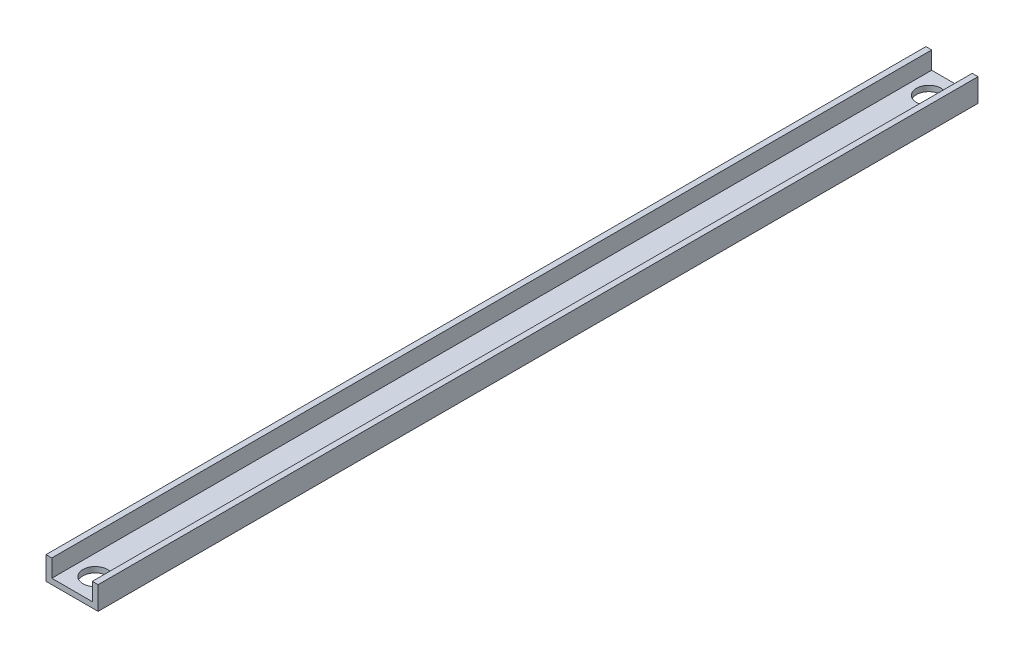
ISO-10303-21;
HEADER;
FILE_DESCRIPTION(('STEP AP214'),'2;1');
FILE_NAME('part.step','',(''),(''),'','','');
FILE_SCHEMA(('AUTOMOTIVE_DESIGN { 1 0 10303 214 1 1 1 1 }'));
ENDSEC;
DATA;
#1=APPLICATION_CONTEXT('core data for automotive mechanical design processes');
#2=APPLICATION_PROTOCOL_DEFINITION('international standard','automotive_design',2000,#1);
#3=PRODUCT_CONTEXT('',#1,'mechanical');
#4=PRODUCT('Part','Part','',(#3));
#5=PRODUCT_RELATED_PRODUCT_CATEGORY('part','',(#4));
#6=PRODUCT_DEFINITION_FORMATION('','',#4);
#7=PRODUCT_DEFINITION_CONTEXT('part definition',#1,'design');
#8=PRODUCT_DEFINITION('design','',#6,#7);
#9=PRODUCT_DEFINITION_SHAPE('','',#8);
#10=(LENGTH_UNIT() NAMED_UNIT(*) SI_UNIT(.MILLI.,.METRE.));
#11=(NAMED_UNIT(*) PLANE_ANGLE_UNIT() SI_UNIT($,.RADIAN.));
#12=(NAMED_UNIT(*) SI_UNIT($,.STERADIAN.) SOLID_ANGLE_UNIT());
#13=UNCERTAINTY_MEASURE_WITH_UNIT(LENGTH_MEASURE(1.E-05),#10,'distance_accuracy_value','');
#14=(GEOMETRIC_REPRESENTATION_CONTEXT(3) GLOBAL_UNCERTAINTY_ASSIGNED_CONTEXT((#13)) GLOBAL_UNIT_ASSIGNED_CONTEXT((#10,
#11,#12)) REPRESENTATION_CONTEXT('',''));
#15=CARTESIAN_POINT('',(0.,0.,0.));
#16=DIRECTION('',(0.,0.,1.));
#17=DIRECTION('',(1.,0.,0.));
#18=AXIS2_PLACEMENT_3D('',#15,#16,#17);
#19=CARTESIAN_POINT('',(-5.55625,-1.651,120.65));
#20=DIRECTION('',(0.,-1.,0.));
#21=DIRECTION('',(1.,0.,0.));
#22=AXIS2_PLACEMENT_3D('',#19,#20,#21);
#23=PLANE('',#22);
#24=DIRECTION('',(-1.,0.,0.));
#25=VECTOR('',#24,1.);
#26=CARTESIAN_POINT('',(-5.55625,-1.651,-120.65));
#27=LINE('',#26,#25);
#28=CARTESIAN_POINT('',(5.55625,-1.651,-120.65));
#29=VERTEX_POINT('',#28);
#30=CARTESIAN_POINT('',(-5.55625,-1.651,-120.65));
#31=VERTEX_POINT('',#30);
#32=EDGE_CURVE('E81',#29,#31,#27,.T.);
#33=ORIENTED_EDGE('',*,*,#32,.T.);
#34=DIRECTION('',(0.,0.,-1.));
#35=VECTOR('',#34,1.);
#36=CARTESIAN_POINT('',(-5.55625,-1.651,120.65));
#37=LINE('',#36,#35);
#38=CARTESIAN_POINT('',(-5.55625,-1.651,120.65));
#39=VERTEX_POINT('',#38);
#40=EDGE_CURVE('E124',#39,#31,#37,.T.);
#41=ORIENTED_EDGE('',*,*,#40,.F.);
#42=DIRECTION('',(-1.,0.,0.));
#43=VECTOR('',#42,1.);
#44=CARTESIAN_POINT('',(-5.55625,-1.651,120.65));
#45=LINE('',#44,#43);
#46=CARTESIAN_POINT('',(5.55625,-1.651,120.65));
#47=VERTEX_POINT('',#46);
#48=EDGE_CURVE('E112',#47,#39,#45,.T.);
#49=ORIENTED_EDGE('',*,*,#48,.F.);
#50=DIRECTION('',(0.,0.,-1.));
#51=VECTOR('',#50,1.);
#52=CARTESIAN_POINT('',(5.55625,-1.651,120.65));
#53=LINE('',#52,#51);
#54=EDGE_CURVE('E119',#47,#29,#53,.T.);
#55=ORIENTED_EDGE('',*,*,#54,.T.);
#56=EDGE_LOOP('',(#33,#41,#49,#55));
#57=FACE_BOUND('',#56,.T.);
#58=CARTESIAN_POINT('',(0.,-1.651,114.3));
#59=DIRECTION('',(0.,1.,0.));
#60=DIRECTION('',(0.,0.,1.));
#61=AXIS2_PLACEMENT_3D('',#58,#59,#60);
#62=CIRCLE('',#61,3.3782);
#63=CARTESIAN_POINT('',(0.,-1.651,117.6782));
#64=VERTEX_POINT('',#63);
#65=EDGE_CURVE('E182',#64,#64,#62,.T.);
#66=ORIENTED_EDGE('',*,*,#65,.F.);
#67=EDGE_LOOP('',(#66));
#68=FACE_BOUND('',#67,.T.);
#69=CARTESIAN_POINT('',(0.,-1.651,-114.3));
#70=DIRECTION('',(0.,1.,0.));
#71=DIRECTION('',(0.,0.,1.));
#72=AXIS2_PLACEMENT_3D('',#69,#70,#71);
#73=CIRCLE('',#72,3.3782);
#74=CARTESIAN_POINT('',(0.,-1.651,-110.9218));
#75=VERTEX_POINT('',#74);
#76=EDGE_CURVE('E188',#75,#75,#73,.T.);
#77=ORIENTED_EDGE('',*,*,#76,.F.);
#78=EDGE_LOOP('',(#77));
#79=FACE_BOUND('',#78,.T.);
#80=ADVANCED_FACE('F35',(#57,#68,#79),#23,.F.);
#81=CARTESIAN_POINT('',(-7.14375,3.175,120.65));
#82=DIRECTION('',(0.,-1.,0.));
#83=DIRECTION('',(1.,0.,0.));
#84=AXIS2_PLACEMENT_3D('',#81,#82,#83);
#85=PLANE('',#84);
#86=DIRECTION('',(-1.,0.,0.));
#87=VECTOR('',#86,1.);
#88=CARTESIAN_POINT('',(-7.14375,3.175,-120.65));
#89=LINE('',#88,#87);
#90=CARTESIAN_POINT('',(-5.55625,3.175,-120.65));
#91=VERTEX_POINT('',#90);
#92=CARTESIAN_POINT('',(-7.14375,3.175,-120.65));
#93=VERTEX_POINT('',#92);
#94=EDGE_CURVE('E132',#91,#93,#89,.T.);
#95=ORIENTED_EDGE('',*,*,#94,.T.);
#96=DIRECTION('',(0.,0.,-1.));
#97=VECTOR('',#96,1.);
#98=CARTESIAN_POINT('',(-7.14375,3.175,120.65));
#99=LINE('',#98,#97);
#100=CARTESIAN_POINT('',(-7.14375,3.175,120.65));
#101=VERTEX_POINT('',#100);
#102=EDGE_CURVE('E11',#101,#93,#99,.T.);
#103=ORIENTED_EDGE('',*,*,#102,.F.);
#104=DIRECTION('',(-1.,0.,0.));
#105=VECTOR('',#104,1.);
#106=CARTESIAN_POINT('',(-7.14375,3.175,120.65));
#107=LINE('',#106,#105);
#108=CARTESIAN_POINT('',(-5.55625,3.175,120.65));
#109=VERTEX_POINT('',#108);
#110=EDGE_CURVE('E147',#109,#101,#107,.T.);
#111=ORIENTED_EDGE('',*,*,#110,.F.);
#112=DIRECTION('',(0.,0.,-1.));
#113=VECTOR('',#112,1.);
#114=CARTESIAN_POINT('',(-5.55625,3.175,120.65));
#115=LINE('',#114,#113);
#116=EDGE_CURVE('E128',#109,#91,#115,.T.);
#117=ORIENTED_EDGE('',*,*,#116,.T.);
#118=EDGE_LOOP('',(#95,#103,#111,#117));
#119=FACE_BOUND('',#118,.T.);
#120=ADVANCED_FACE('F37',(#119),#85,.F.);
#121=CARTESIAN_POINT('',(-7.14375,3.175,120.65));
#122=DIRECTION('',(1.,0.,0.));
#123=DIRECTION('',(0.,1.,0.));
#124=AXIS2_PLACEMENT_3D('',#121,#122,#123);
#125=PLANE('',#124);
#126=DIRECTION('',(0.,-1.,0.));
#127=VECTOR('',#126,1.);
#128=CARTESIAN_POINT('',(-7.14375,3.175,-120.65));
#129=LINE('',#128,#127);
#130=CARTESIAN_POINT('',(-7.14375,-3.175,-120.65));
#131=VERTEX_POINT('',#130);
#132=EDGE_CURVE('E135',#93,#131,#129,.T.);
#133=ORIENTED_EDGE('',*,*,#132,.T.);
#134=DIRECTION('',(0.,0.,-1.));
#135=VECTOR('',#134,1.);
#136=CARTESIAN_POINT('',(-7.14375,-3.175,120.65));
#137=LINE('',#136,#135);
#138=CARTESIAN_POINT('',(-7.14375,-3.175,120.65));
#139=VERTEX_POINT('',#138);
#140=EDGE_CURVE('E44',#139,#131,#137,.T.);
#141=ORIENTED_EDGE('',*,*,#140,.F.);
#142=DIRECTION('',(0.,-1.,0.));
#143=VECTOR('',#142,1.);
#144=CARTESIAN_POINT('',(-7.14375,3.175,120.65));
#145=LINE('',#144,#143);
#146=EDGE_CURVE('E95',#101,#139,#145,.T.);
#147=ORIENTED_EDGE('',*,*,#146,.F.);
#148=ORIENTED_EDGE('',*,*,#102,.T.);
#149=EDGE_LOOP('',(#133,#141,#147,#148));
#150=FACE_BOUND('',#149,.T.);
#151=ADVANCED_FACE('F199',(#150),#125,.F.);
#152=CARTESIAN_POINT('',(-7.14375,-3.175,120.65));
#153=DIRECTION('',(0.,1.,0.));
#154=DIRECTION('',(-1.,0.,0.));
#155=AXIS2_PLACEMENT_3D('',#152,#153,#154);
#156=PLANE('',#155);
#157=CARTESIAN_POINT('',(0.,-3.175,-114.3));
#158=DIRECTION('',(0.,1.,0.));
#159=DIRECTION('',(-1.,0.,0.));
#160=AXIS2_PLACEMENT_3D('',#157,#158,#159);
#161=CIRCLE('',#160,3.3782);
#162=CARTESIAN_POINT('',(-3.3782,-3.175,-114.3));
#163=VERTEX_POINT('',#162);
#164=EDGE_CURVE('E185',#163,#163,#161,.T.);
#165=ORIENTED_EDGE('',*,*,#164,.T.);
#166=EDGE_LOOP('',(#165));
#167=FACE_BOUND('',#166,.T.);
#168=CARTESIAN_POINT('',(0.,-3.175,114.3));
#169=DIRECTION('',(0.,1.,0.));
#170=DIRECTION('',(-1.,0.,0.));
#171=AXIS2_PLACEMENT_3D('',#168,#169,#170);
#172=CIRCLE('',#171,3.3782);
#173=CARTESIAN_POINT('',(-3.3782,-3.175,114.3));
#174=VERTEX_POINT('',#173);
#175=EDGE_CURVE('E136',#174,#174,#172,.T.);
#176=ORIENTED_EDGE('',*,*,#175,.T.);
#177=EDGE_LOOP('',(#176));
#178=FACE_BOUND('',#177,.T.);
#179=DIRECTION('',(1.,0.,0.));
#180=VECTOR('',#179,1.);
#181=CARTESIAN_POINT('',(-7.14375,-3.175,-120.65));
#182=LINE('',#181,#180);
#183=CARTESIAN_POINT('',(7.14375,-3.175,-120.65));
#184=VERTEX_POINT('',#183);
#185=EDGE_CURVE('E138',#131,#184,#182,.T.);
#186=ORIENTED_EDGE('',*,*,#185,.T.);
#187=DIRECTION('',(0.,0.,-1.));
#188=VECTOR('',#187,1.);
#189=CARTESIAN_POINT('',(7.14375,-3.175,120.65));
#190=LINE('',#189,#188);
#191=CARTESIAN_POINT('',(7.14375,-3.175,120.65));
#192=VERTEX_POINT('',#191);
#193=EDGE_CURVE('E154',#192,#184,#190,.T.);
#194=ORIENTED_EDGE('',*,*,#193,.F.);
#195=DIRECTION('',(1.,0.,0.));
#196=VECTOR('',#195,1.);
#197=CARTESIAN_POINT('',(-7.14375,-3.175,120.65));
#198=LINE('',#197,#196);
#199=EDGE_CURVE('E162',#139,#192,#198,.T.);
#200=ORIENTED_EDGE('',*,*,#199,.F.);
#201=ORIENTED_EDGE('',*,*,#140,.T.);
#202=EDGE_LOOP('',(#186,#194,#200,#201));
#203=FACE_BOUND('',#202,.T.);
#204=ADVANCED_FACE('F160',(#167,#178,#203),#156,.F.);
#205=CARTESIAN_POINT('',(7.14375,-3.175,120.65));
#206=DIRECTION('',(-1.,0.,0.));
#207=DIRECTION('',(0.,-1.,0.));
#208=AXIS2_PLACEMENT_3D('',#205,#206,#207);
#209=PLANE('',#208);
#210=DIRECTION('',(0.,1.,0.));
#211=VECTOR('',#210,1.);
#212=CARTESIAN_POINT('',(7.14375,-3.175,-120.65));
#213=LINE('',#212,#211);
#214=CARTESIAN_POINT('',(7.14375,3.175,-120.65));
#215=VERTEX_POINT('',#214);
#216=EDGE_CURVE('E140',#184,#215,#213,.T.);
#217=ORIENTED_EDGE('',*,*,#216,.T.);
#218=DIRECTION('',(0.,0.,-1.));
#219=VECTOR('',#218,1.);
#220=CARTESIAN_POINT('',(7.14375,3.175,120.65));
#221=LINE('',#220,#219);
#222=CARTESIAN_POINT('',(7.14375,3.175,120.65));
#223=VERTEX_POINT('',#222);
#224=EDGE_CURVE('E151',#223,#215,#221,.T.);
#225=ORIENTED_EDGE('',*,*,#224,.F.);
#226=DIRECTION('',(0.,1.,0.));
#227=VECTOR('',#226,1.);
#228=CARTESIAN_POINT('',(7.14375,-3.175,120.65));
#229=LINE('',#228,#227);
#230=EDGE_CURVE('E174',#192,#223,#229,.T.);
#231=ORIENTED_EDGE('',*,*,#230,.F.);
#232=ORIENTED_EDGE('',*,*,#193,.T.);
#233=EDGE_LOOP('',(#217,#225,#231,#232));
#234=FACE_BOUND('',#233,.T.);
#235=ADVANCED_FACE('F170',(#234),#209,.F.);
#236=CARTESIAN_POINT('',(5.55625,3.175,120.65));
#237=DIRECTION('',(0.,-1.,0.));
#238=DIRECTION('',(1.,0.,0.));
#239=AXIS2_PLACEMENT_3D('',#236,#237,#238);
#240=PLANE('',#239);
#241=DIRECTION('',(-1.,0.,0.));
#242=VECTOR('',#241,1.);
#243=CARTESIAN_POINT('',(5.55625,3.175,-120.65));
#244=LINE('',#243,#242);
#245=CARTESIAN_POINT('',(5.55625,3.175,-120.65));
#246=VERTEX_POINT('',#245);
#247=EDGE_CURVE('E142',#215,#246,#244,.T.);
#248=ORIENTED_EDGE('',*,*,#247,.T.);
#249=DIRECTION('',(0.,0.,-1.));
#250=VECTOR('',#249,1.);
#251=CARTESIAN_POINT('',(5.55625,3.175,120.65));
#252=LINE('',#251,#250);
#253=CARTESIAN_POINT('',(5.55625,3.175,120.65));
#254=VERTEX_POINT('',#253);
#255=EDGE_CURVE('E123',#254,#246,#252,.T.);
#256=ORIENTED_EDGE('',*,*,#255,.F.);
#257=DIRECTION('',(-1.,0.,0.));
#258=VECTOR('',#257,1.);
#259=CARTESIAN_POINT('',(5.55625,3.175,120.65));
#260=LINE('',#259,#258);
#261=EDGE_CURVE('E114',#223,#254,#260,.T.);
#262=ORIENTED_EDGE('',*,*,#261,.F.);
#263=ORIENTED_EDGE('',*,*,#224,.T.);
#264=EDGE_LOOP('',(#248,#256,#262,#263));
#265=FACE_BOUND('',#264,.T.);
#266=ADVANCED_FACE('F173',(#265),#240,.F.);
#267=CARTESIAN_POINT('',(5.55625,-1.651,120.65));
#268=DIRECTION('',(1.,0.,0.));
#269=DIRECTION('',(0.,1.,0.));
#270=AXIS2_PLACEMENT_3D('',#267,#268,#269);
#271=PLANE('',#270);
#272=DIRECTION('',(0.,-1.,0.));
#273=VECTOR('',#272,1.);
#274=CARTESIAN_POINT('',(5.55625,-1.651,-120.65));
#275=LINE('',#274,#273);
#276=EDGE_CURVE('E122',#246,#29,#275,.T.);
#277=ORIENTED_EDGE('',*,*,#276,.T.);
#278=ORIENTED_EDGE('',*,*,#54,.F.);
#279=DIRECTION('',(0.,-1.,0.));
#280=VECTOR('',#279,1.);
#281=CARTESIAN_POINT('',(5.55625,-1.651,120.65));
#282=LINE('',#281,#280);
#283=EDGE_CURVE('E108',#254,#47,#282,.T.);
#284=ORIENTED_EDGE('',*,*,#283,.F.);
#285=ORIENTED_EDGE('',*,*,#255,.T.);
#286=EDGE_LOOP('',(#277,#278,#284,#285));
#287=FACE_BOUND('',#286,.T.);
#288=ADVANCED_FACE('F120',(#287),#271,.F.);
#289=CARTESIAN_POINT('',(-5.55625,3.175,120.65));
#290=DIRECTION('',(-1.,0.,0.));
#291=DIRECTION('',(0.,-1.,0.));
#292=AXIS2_PLACEMENT_3D('',#289,#290,#291);
#293=PLANE('',#292);
#294=DIRECTION('',(0.,1.,0.));
#295=VECTOR('',#294,1.);
#296=CARTESIAN_POINT('',(-5.55625,3.175,-120.65));
#297=LINE('',#296,#295);
#298=EDGE_CURVE('E87',#31,#91,#297,.T.);
#299=ORIENTED_EDGE('',*,*,#298,.T.);
#300=ORIENTED_EDGE('',*,*,#116,.F.);
#301=DIRECTION('',(0.,1.,0.));
#302=VECTOR('',#301,1.);
#303=CARTESIAN_POINT('',(-5.55625,3.175,120.65));
#304=LINE('',#303,#302);
#305=EDGE_CURVE('E52',#39,#109,#304,.T.);
#306=ORIENTED_EDGE('',*,*,#305,.F.);
#307=ORIENTED_EDGE('',*,*,#40,.T.);
#308=EDGE_LOOP('',(#299,#300,#306,#307));
#309=FACE_BOUND('',#308,.T.);
#310=ADVANCED_FACE('F203',(#309),#293,.F.);
#311=CARTESIAN_POINT('',(-5.55625,3.175,120.65));
#312=DIRECTION('',(0.,0.,-1.));
#313=DIRECTION('',(-1.,0.,0.));
#314=AXIS2_PLACEMENT_3D('',#311,#312,#313);
#315=PLANE('',#314);
#316=ORIENTED_EDGE('',*,*,#110,.T.);
#317=ORIENTED_EDGE('',*,*,#146,.T.);
#318=ORIENTED_EDGE('',*,*,#199,.T.);
#319=ORIENTED_EDGE('',*,*,#230,.T.);
#320=ORIENTED_EDGE('',*,*,#261,.T.);
#321=ORIENTED_EDGE('',*,*,#283,.T.);
#322=ORIENTED_EDGE('',*,*,#48,.T.);
#323=ORIENTED_EDGE('',*,*,#305,.T.);
#324=EDGE_LOOP('',(#316,#317,#318,#319,#320,#321,#322,#323));
#325=FACE_BOUND('',#324,.T.);
#326=ADVANCED_FACE('F110',(#325),#315,.F.);
#327=CARTESIAN_POINT('',(-5.55625,3.175,-120.65));
#328=DIRECTION('',(0.,0.,-1.));
#329=DIRECTION('',(-1.,0.,0.));
#330=AXIS2_PLACEMENT_3D('',#327,#328,#329);
#331=PLANE('',#330);
#332=ORIENTED_EDGE('',*,*,#94,.F.);
#333=ORIENTED_EDGE('',*,*,#298,.F.);
#334=ORIENTED_EDGE('',*,*,#32,.F.);
#335=ORIENTED_EDGE('',*,*,#276,.F.);
#336=ORIENTED_EDGE('',*,*,#247,.F.);
#337=ORIENTED_EDGE('',*,*,#216,.F.);
#338=ORIENTED_EDGE('',*,*,#185,.F.);
#339=ORIENTED_EDGE('',*,*,#132,.F.);
#340=EDGE_LOOP('',(#332,#333,#334,#335,#336,#337,#338,#339));
#341=FACE_BOUND('',#340,.T.);
#342=ADVANCED_FACE('F166',(#341),#331,.T.);
#343=CARTESIAN_POINT('',(0.,-1.651,114.3));
#344=DIRECTION('',(0.,1.,0.));
#345=DIRECTION('',(0.,0.,1.));
#346=AXIS2_PLACEMENT_3D('',#343,#344,#345);
#347=CYLINDRICAL_SURFACE('',#346,3.3782);
#348=ORIENTED_EDGE('',*,*,#175,.F.);
#349=EDGE_LOOP('',(#348));
#350=FACE_BOUND('',#349,.T.);
#351=ORIENTED_EDGE('',*,*,#65,.T.);
#352=EDGE_LOOP('',(#351));
#353=FACE_BOUND('',#352,.T.);
#354=ADVANCED_FACE('F226',(#350,#353),#347,.F.);
#355=CARTESIAN_POINT('',(0.,-1.651,-114.3));
#356=DIRECTION('',(0.,1.,0.));
#357=DIRECTION('',(0.,0.,1.));
#358=AXIS2_PLACEMENT_3D('',#355,#356,#357);
#359=CYLINDRICAL_SURFACE('',#358,3.3782);
#360=ORIENTED_EDGE('',*,*,#164,.F.);
#361=EDGE_LOOP('',(#360));
#362=FACE_BOUND('',#361,.T.);
#363=ORIENTED_EDGE('',*,*,#76,.T.);
#364=EDGE_LOOP('',(#363));
#365=FACE_BOUND('',#364,.T.);
#366=ADVANCED_FACE('F192',(#362,#365),#359,.F.);
#367=CLOSED_SHELL('',(#80,#120,#151,#204,#235,#266,#288,#310,#326,#342,#354,#366));
#368=MANIFOLD_SOLID_BREP('B2',#367);
#369=ADVANCED_BREP_SHAPE_REPRESENTATION('',(#18,#368),#14);
#370=SHAPE_DEFINITION_REPRESENTATION(#9,#369);
ENDSEC;
END-ISO-10303-21;
